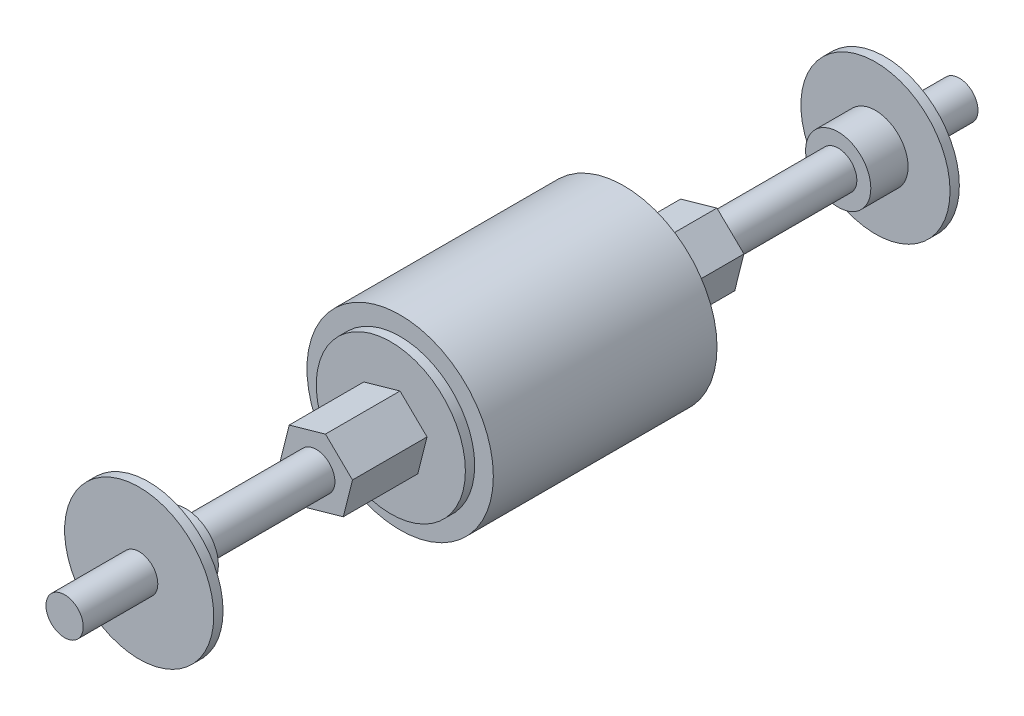
ISO-10303-21;
HEADER;
FILE_DESCRIPTION(('STEP AP214'),'2;1');
FILE_NAME('part.step','',(''),(''),'','','');
FILE_SCHEMA(('AUTOMOTIVE_DESIGN { 1 0 10303 214 1 1 1 1 }'));
ENDSEC;
DATA;
#1=APPLICATION_CONTEXT('core data for automotive mechanical design processes');
#2=APPLICATION_PROTOCOL_DEFINITION('international standard','automotive_design',2000,#1);
#3=PRODUCT_CONTEXT('',#1,'mechanical');
#4=PRODUCT('Part','Part','',(#3));
#5=PRODUCT_RELATED_PRODUCT_CATEGORY('part','',(#4));
#6=PRODUCT_DEFINITION_FORMATION('','',#4);
#7=PRODUCT_DEFINITION_CONTEXT('part definition',#1,'design');
#8=PRODUCT_DEFINITION('design','',#6,#7);
#9=PRODUCT_DEFINITION_SHAPE('','',#8);
#10=(LENGTH_UNIT() NAMED_UNIT(*) SI_UNIT(.MILLI.,.METRE.));
#11=(NAMED_UNIT(*) PLANE_ANGLE_UNIT() SI_UNIT($,.RADIAN.));
#12=(NAMED_UNIT(*) SI_UNIT($,.STERADIAN.) SOLID_ANGLE_UNIT());
#13=UNCERTAINTY_MEASURE_WITH_UNIT(LENGTH_MEASURE(1.E-05),#10,'distance_accuracy_value','');
#14=(GEOMETRIC_REPRESENTATION_CONTEXT(3) GLOBAL_UNCERTAINTY_ASSIGNED_CONTEXT((#13)) GLOBAL_UNIT_ASSIGNED_CONTEXT((#10,
#11,#12)) REPRESENTATION_CONTEXT('',''));
#15=CARTESIAN_POINT('',(0.,0.,0.));
#16=DIRECTION('',(0.,0.,1.));
#17=DIRECTION('',(1.,0.,0.));
#18=AXIS2_PLACEMENT_3D('',#15,#16,#17);
#19=CARTESIAN_POINT('',(0.,0.,-20.6375));
#20=DIRECTION('',(0.,0.,-1.));
#21=DIRECTION('',(1.,0.,0.));
#22=AXIS2_PLACEMENT_3D('',#19,#20,#21);
#23=PLANE('',#22);
#24=CARTESIAN_POINT('',(0.,0.,-20.6375));
#25=DIRECTION('',(0.,0.,1.));
#26=DIRECTION('',(1.,0.,0.));
#27=AXIS2_PLACEMENT_3D('',#24,#25,#26);
#28=CIRCLE('',#27,12.7);
#29=CARTESIAN_POINT('',(12.7,0.,-20.6375));
#30=VERTEX_POINT('',#29);
#31=EDGE_CURVE('E209',#30,#30,#28,.T.);
#32=ORIENTED_EDGE('',*,*,#31,.F.);
#33=EDGE_LOOP('',(#32));
#34=FACE_BOUND('',#33,.T.);
#35=DIRECTION('',(0.717469018062941,-0.696590416327844,0.));
#36=VECTOR('',#35,1.);
#37=CARTESIAN_POINT('',(-6.17200110950044,-1.75184314014087,-20.6375));
#38=LINE('',#37,#36);
#39=CARTESIAN_POINT('',(-6.17200110950044,-1.75184314014087,-20.6375));
#40=VERTEX_POINT('',#39);
#41=CARTESIAN_POINT('',(-1.56885989194273,-6.22103132308356,-20.6375));
#42=VERTEX_POINT('',#41);
#43=EDGE_CURVE('E177',#40,#42,#38,.T.);
#44=ORIENTED_EDGE('',*,*,#43,.T.);
#45=DIRECTION('',(0.961999505604162,0.273051187906861,0.));
#46=VECTOR('',#45,1.);
#47=CARTESIAN_POINT('',(-1.56885989194273,-6.22103132308356,-20.6375));
#48=LINE('',#47,#46);
#49=CARTESIAN_POINT('',(4.60314121755772,-4.46918818294269,-20.6375));
#50=VERTEX_POINT('',#49);
#51=EDGE_CURVE('E59',#42,#50,#48,.T.);
#52=ORIENTED_EDGE('',*,*,#51,.T.);
#53=DIRECTION('',(0.244530487541221,0.969641604234705,0.));
#54=VECTOR('',#53,1.);
#55=CARTESIAN_POINT('',(4.60314121755772,-4.46918818294269,-20.6375));
#56=LINE('',#55,#54);
#57=CARTESIAN_POINT('',(6.17200110950044,1.75184314014087,-20.6375));
#58=VERTEX_POINT('',#57);
#59=EDGE_CURVE('E154',#50,#58,#56,.T.);
#60=ORIENTED_EDGE('',*,*,#59,.T.);
#61=DIRECTION('',(-0.717469018062941,0.696590416327844,0.));
#62=VECTOR('',#61,1.);
#63=CARTESIAN_POINT('',(6.17200110950044,1.75184314014087,-20.6375));
#64=LINE('',#63,#62);
#65=CARTESIAN_POINT('',(1.56885989194273,6.22103132308356,-20.6375));
#66=VERTEX_POINT('',#65);
#67=EDGE_CURVE('E189',#58,#66,#64,.T.);
#68=ORIENTED_EDGE('',*,*,#67,.T.);
#69=DIRECTION('',(-0.961999505604162,-0.273051187906861,0.));
#70=VECTOR('',#69,1.);
#71=CARTESIAN_POINT('',(1.56885989194273,6.22103132308356,-20.6375));
#72=LINE('',#71,#70);
#73=CARTESIAN_POINT('',(-4.60314121755772,4.46918818294269,-20.6375));
#74=VERTEX_POINT('',#73);
#75=EDGE_CURVE('E185',#66,#74,#72,.T.);
#76=ORIENTED_EDGE('',*,*,#75,.T.);
#77=DIRECTION('',(-0.244530487541221,-0.969641604234705,0.));
#78=VECTOR('',#77,1.);
#79=CARTESIAN_POINT('',(-4.60314121755772,4.46918818294269,-20.6375));
#80=LINE('',#79,#78);
#81=EDGE_CURVE('E181',#74,#40,#80,.T.);
#82=ORIENTED_EDGE('',*,*,#81,.T.);
#83=EDGE_LOOP('',(#44,#52,#60,#68,#76,#82));
#84=FACE_BOUND('',#83,.T.);
#85=ADVANCED_FACE('F41',(#34,#84),#23,.T.);
#86=CARTESIAN_POINT('',(0.,0.,19.05));
#87=DIRECTION('',(0.,0.,-1.));
#88=DIRECTION('',(-1.,0.,0.));
#89=AXIS2_PLACEMENT_3D('',#86,#87,#88);
#90=CYLINDRICAL_SURFACE('',#89,15.875);
#91=CARTESIAN_POINT('',(0.,0.,19.05));
#92=DIRECTION('',(0.,0.,1.));
#93=DIRECTION('',(1.,0.,0.));
#94=AXIS2_PLACEMENT_3D('',#91,#92,#93);
#95=CIRCLE('',#94,15.875);
#96=CARTESIAN_POINT('',(15.875,0.,19.05));
#97=VERTEX_POINT('',#96);
#98=EDGE_CURVE('E45',#97,#97,#95,.T.);
#99=ORIENTED_EDGE('',*,*,#98,.F.);
#100=EDGE_LOOP('',(#99));
#101=FACE_BOUND('',#100,.T.);
#102=CARTESIAN_POINT('',(0.,0.,-19.05));
#103=DIRECTION('',(0.,0.,1.));
#104=DIRECTION('',(1.,0.,0.));
#105=AXIS2_PLACEMENT_3D('',#102,#103,#104);
#106=CIRCLE('',#105,15.875);
#107=CARTESIAN_POINT('',(15.875,0.,-19.05));
#108=VERTEX_POINT('',#107);
#109=EDGE_CURVE('E213',#108,#108,#106,.T.);
#110=ORIENTED_EDGE('',*,*,#109,.T.);
#111=EDGE_LOOP('',(#110));
#112=FACE_BOUND('',#111,.T.);
#113=ADVANCED_FACE('F43',(#101,#112),#90,.T.);
#114=CARTESIAN_POINT('',(0.,0.,19.05));
#115=DIRECTION('',(0.,0.,1.));
#116=DIRECTION('',(1.,0.,0.));
#117=AXIS2_PLACEMENT_3D('',#114,#115,#116);
#118=PLANE('',#117);
#119=CARTESIAN_POINT('',(0.,0.,19.05));
#120=DIRECTION('',(0.,0.,1.));
#121=DIRECTION('',(1.,0.,0.));
#122=AXIS2_PLACEMENT_3D('',#119,#120,#121);
#123=CIRCLE('',#122,12.7);
#124=CARTESIAN_POINT('',(12.7,0.,19.05));
#125=VERTEX_POINT('',#124);
#126=EDGE_CURVE('E247',#125,#125,#123,.T.);
#127=ORIENTED_EDGE('',*,*,#126,.F.);
#128=EDGE_LOOP('',(#127));
#129=FACE_BOUND('',#128,.T.);
#130=ORIENTED_EDGE('',*,*,#98,.T.);
#131=EDGE_LOOP('',(#130));
#132=FACE_BOUND('',#131,.T.);
#133=ADVANCED_FACE('F323',(#129,#132),#118,.T.);
#134=CARTESIAN_POINT('',(0.,0.,20.6375));
#135=DIRECTION('',(0.,0.,-1.));
#136=DIRECTION('',(-1.,0.,0.));
#137=AXIS2_PLACEMENT_3D('',#134,#135,#136);
#138=CYLINDRICAL_SURFACE('',#137,12.7);
#139=CARTESIAN_POINT('',(0.,0.,20.6375));
#140=DIRECTION('',(0.,0.,1.));
#141=DIRECTION('',(1.,0.,0.));
#142=AXIS2_PLACEMENT_3D('',#139,#140,#141);
#143=CIRCLE('',#142,12.7);
#144=CARTESIAN_POINT('',(12.7,0.,20.6375));
#145=VERTEX_POINT('',#144);
#146=EDGE_CURVE('E312',#145,#145,#143,.T.);
#147=ORIENTED_EDGE('',*,*,#146,.F.);
#148=EDGE_LOOP('',(#147));
#149=FACE_BOUND('',#148,.T.);
#150=ORIENTED_EDGE('',*,*,#126,.T.);
#151=EDGE_LOOP('',(#150));
#152=FACE_BOUND('',#151,.T.);
#153=ADVANCED_FACE('F687',(#149,#152),#138,.T.);
#154=CARTESIAN_POINT('',(0.,0.,20.6375));
#155=DIRECTION('',(0.,0.,1.));
#156=DIRECTION('',(1.,0.,0.));
#157=AXIS2_PLACEMENT_3D('',#154,#155,#156);
#158=PLANE('',#157);
#159=DIRECTION('',(0.961999505604162,0.273051187906861,0.));
#160=VECTOR('',#159,1.);
#161=CARTESIAN_POINT('',(-1.56885989194273,-6.22103132308356,20.6375));
#162=LINE('',#161,#160);
#163=CARTESIAN_POINT('',(-1.56885989194273,-6.22103132308356,20.6375));
#164=VERTEX_POINT('',#163);
#165=CARTESIAN_POINT('',(4.60314121755772,-4.46918818294269,20.6375));
#166=VERTEX_POINT('',#165);
#167=EDGE_CURVE('E67',#164,#166,#162,.T.);
#168=ORIENTED_EDGE('',*,*,#167,.F.);
#169=DIRECTION('',(0.717469018062941,-0.696590416327844,0.));
#170=VECTOR('',#169,1.);
#171=CARTESIAN_POINT('',(-6.17200110950044,-1.75184314014087,20.6375));
#172=LINE('',#171,#170);
#173=CARTESIAN_POINT('',(-6.17200110950044,-1.75184314014087,20.6375));
#174=VERTEX_POINT('',#173);
#175=EDGE_CURVE('E253',#174,#164,#172,.T.);
#176=ORIENTED_EDGE('',*,*,#175,.F.);
#177=DIRECTION('',(-0.244530487541221,-0.969641604234705,0.));
#178=VECTOR('',#177,1.);
#179=CARTESIAN_POINT('',(-4.60314121755772,4.46918818294269,20.6375));
#180=LINE('',#179,#178);
#181=CARTESIAN_POINT('',(-4.60314121755772,4.46918818294269,20.6375));
#182=VERTEX_POINT('',#181);
#183=EDGE_CURVE('E283',#182,#174,#180,.T.);
#184=ORIENTED_EDGE('',*,*,#183,.F.);
#185=DIRECTION('',(-0.961999505604162,-0.273051187906861,0.));
#186=VECTOR('',#185,1.);
#187=CARTESIAN_POINT('',(1.56885989194273,6.22103132308356,20.6375));
#188=LINE('',#187,#186);
#189=CARTESIAN_POINT('',(1.56885989194273,6.22103132308356,20.6375));
#190=VERTEX_POINT('',#189);
#191=EDGE_CURVE('E279',#190,#182,#188,.T.);
#192=ORIENTED_EDGE('',*,*,#191,.F.);
#193=DIRECTION('',(-0.717469018062941,0.696590416327844,0.));
#194=VECTOR('',#193,1.);
#195=CARTESIAN_POINT('',(6.17200110950044,1.75184314014087,20.6375));
#196=LINE('',#195,#194);
#197=CARTESIAN_POINT('',(6.17200110950044,1.75184314014087,20.6375));
#198=VERTEX_POINT('',#197);
#199=EDGE_CURVE('E275',#198,#190,#196,.T.);
#200=ORIENTED_EDGE('',*,*,#199,.F.);
#201=DIRECTION('',(0.244530487541221,0.969641604234705,0.));
#202=VECTOR('',#201,1.);
#203=CARTESIAN_POINT('',(4.60314121755772,-4.46918818294269,20.6375));
#204=LINE('',#203,#202);
#205=EDGE_CURVE('E271',#166,#198,#204,.T.);
#206=ORIENTED_EDGE('',*,*,#205,.F.);
#207=EDGE_LOOP('',(#168,#176,#184,#192,#200,#206));
#208=FACE_BOUND('',#207,.T.);
#209=ORIENTED_EDGE('',*,*,#146,.T.);
#210=EDGE_LOOP('',(#209));
#211=FACE_BOUND('',#210,.T.);
#212=ADVANCED_FACE('F677',(#208,#211),#158,.T.);
#213=CARTESIAN_POINT('',(-1.56885989194273,-6.22103132308356,33.3375));
#214=DIRECTION('',(-0.273051187906861,0.961999505604162,0.));
#215=DIRECTION('',(-0.961999505604162,-0.273051187906861,0.));
#216=AXIS2_PLACEMENT_3D('',#213,#214,#215);
#217=PLANE('',#216);
#218=ORIENTED_EDGE('',*,*,#167,.T.);
#219=DIRECTION('',(0.,0.,-1.));
#220=VECTOR('',#219,1.);
#221=CARTESIAN_POINT('',(4.60314121755772,-4.46918818294269,33.3375));
#222=LINE('',#221,#220);
#223=CARTESIAN_POINT('',(4.60314121755772,-4.46918818294269,33.3375));
#224=VERTEX_POINT('',#223);
#225=EDGE_CURVE('E308',#224,#166,#222,.T.);
#226=ORIENTED_EDGE('',*,*,#225,.F.);
#227=DIRECTION('',(0.961999505604162,0.273051187906861,0.));
#228=VECTOR('',#227,1.);
#229=CARTESIAN_POINT('',(-1.56885989194273,-6.22103132308356,33.3375));
#230=LINE('',#229,#228);
#231=CARTESIAN_POINT('',(-1.56885989194273,-6.22103132308356,33.3375));
#232=VERTEX_POINT('',#231);
#233=EDGE_CURVE('E248',#232,#224,#230,.T.);
#234=ORIENTED_EDGE('',*,*,#233,.F.);
#235=DIRECTION('',(0.,0.,-1.));
#236=VECTOR('',#235,1.);
#237=CARTESIAN_POINT('',(-1.56885989194273,-6.22103132308356,33.3375));
#238=LINE('',#237,#236);
#239=EDGE_CURVE('E268',#232,#164,#238,.T.);
#240=ORIENTED_EDGE('',*,*,#239,.T.);
#241=EDGE_LOOP('',(#218,#226,#234,#240));
#242=FACE_BOUND('',#241,.T.);
#243=ADVANCED_FACE('F667',(#242),#217,.F.);
#244=CARTESIAN_POINT('',(4.60314121755772,-4.46918818294269,33.3375));
#245=DIRECTION('',(-0.969641604234705,0.244530487541221,0.));
#246=DIRECTION('',(-0.244530487541221,-0.969641604234705,0.));
#247=AXIS2_PLACEMENT_3D('',#244,#245,#246);
#248=PLANE('',#247);
#249=ORIENTED_EDGE('',*,*,#205,.T.);
#250=DIRECTION('',(0.,0.,-1.));
#251=VECTOR('',#250,1.);
#252=CARTESIAN_POINT('',(6.17200110950044,1.75184314014087,33.3375));
#253=LINE('',#252,#251);
#254=CARTESIAN_POINT('',(6.17200110950044,1.75184314014087,33.3375));
#255=VERTEX_POINT('',#254);
#256=EDGE_CURVE('E304',#255,#198,#253,.T.);
#257=ORIENTED_EDGE('',*,*,#256,.F.);
#258=DIRECTION('',(0.244530487541221,0.969641604234705,0.));
#259=VECTOR('',#258,1.);
#260=CARTESIAN_POINT('',(4.60314121755772,-4.46918818294269,33.3375));
#261=LINE('',#260,#259);
#262=EDGE_CURVE('E252',#224,#255,#261,.T.);
#263=ORIENTED_EDGE('',*,*,#262,.F.);
#264=ORIENTED_EDGE('',*,*,#225,.T.);
#265=EDGE_LOOP('',(#249,#257,#263,#264));
#266=FACE_BOUND('',#265,.T.);
#267=ADVANCED_FACE('F657',(#266),#248,.F.);
#268=CARTESIAN_POINT('',(6.17200110950044,1.75184314014087,33.3375));
#269=DIRECTION('',(-0.696590416327844,-0.717469018062941,0.));
#270=DIRECTION('',(0.717469018062941,-0.696590416327844,0.));
#271=AXIS2_PLACEMENT_3D('',#268,#269,#270);
#272=PLANE('',#271);
#273=ORIENTED_EDGE('',*,*,#199,.T.);
#274=DIRECTION('',(0.,0.,-1.));
#275=VECTOR('',#274,1.);
#276=CARTESIAN_POINT('',(1.56885989194273,6.22103132308356,33.3375));
#277=LINE('',#276,#275);
#278=CARTESIAN_POINT('',(1.56885989194273,6.22103132308356,33.3375));
#279=VERTEX_POINT('',#278);
#280=EDGE_CURVE('E300',#279,#190,#277,.T.);
#281=ORIENTED_EDGE('',*,*,#280,.F.);
#282=DIRECTION('',(-0.717469018062941,0.696590416327844,0.));
#283=VECTOR('',#282,1.);
#284=CARTESIAN_POINT('',(6.17200110950044,1.75184314014087,33.3375));
#285=LINE('',#284,#283);
#286=EDGE_CURVE('E256',#255,#279,#285,.T.);
#287=ORIENTED_EDGE('',*,*,#286,.F.);
#288=ORIENTED_EDGE('',*,*,#256,.T.);
#289=EDGE_LOOP('',(#273,#281,#287,#288));
#290=FACE_BOUND('',#289,.T.);
#291=ADVANCED_FACE('F647',(#290),#272,.F.);
#292=CARTESIAN_POINT('',(1.56885989194273,6.22103132308356,33.3375));
#293=DIRECTION('',(0.273051187906861,-0.961999505604162,0.));
#294=DIRECTION('',(0.961999505604162,0.273051187906861,0.));
#295=AXIS2_PLACEMENT_3D('',#292,#293,#294);
#296=PLANE('',#295);
#297=ORIENTED_EDGE('',*,*,#191,.T.);
#298=DIRECTION('',(0.,0.,-1.));
#299=VECTOR('',#298,1.);
#300=CARTESIAN_POINT('',(-4.60314121755772,4.46918818294269,33.3375));
#301=LINE('',#300,#299);
#302=CARTESIAN_POINT('',(-4.60314121755772,4.46918818294269,33.3375));
#303=VERTEX_POINT('',#302);
#304=EDGE_CURVE('E296',#303,#182,#301,.T.);
#305=ORIENTED_EDGE('',*,*,#304,.F.);
#306=DIRECTION('',(-0.961999505604162,-0.273051187906861,0.));
#307=VECTOR('',#306,1.);
#308=CARTESIAN_POINT('',(1.56885989194273,6.22103132308356,33.3375));
#309=LINE('',#308,#307);
#310=EDGE_CURVE('E259',#279,#303,#309,.T.);
#311=ORIENTED_EDGE('',*,*,#310,.F.);
#312=ORIENTED_EDGE('',*,*,#280,.T.);
#313=EDGE_LOOP('',(#297,#305,#311,#312));
#314=FACE_BOUND('',#313,.T.);
#315=ADVANCED_FACE('F637',(#314),#296,.F.);
#316=CARTESIAN_POINT('',(-4.60314121755772,4.46918818294269,33.3375));
#317=DIRECTION('',(0.969641604234705,-0.244530487541221,0.));
#318=DIRECTION('',(0.244530487541221,0.969641604234705,0.));
#319=AXIS2_PLACEMENT_3D('',#316,#317,#318);
#320=PLANE('',#319);
#321=ORIENTED_EDGE('',*,*,#183,.T.);
#322=DIRECTION('',(0.,0.,-1.));
#323=VECTOR('',#322,1.);
#324=CARTESIAN_POINT('',(-6.17200110950044,-1.75184314014087,33.3375));
#325=LINE('',#324,#323);
#326=CARTESIAN_POINT('',(-6.17200110950044,-1.75184314014087,33.3375));
#327=VERTEX_POINT('',#326);
#328=EDGE_CURVE('E292',#327,#174,#325,.T.);
#329=ORIENTED_EDGE('',*,*,#328,.F.);
#330=DIRECTION('',(-0.244530487541221,-0.969641604234705,0.));
#331=VECTOR('',#330,1.);
#332=CARTESIAN_POINT('',(-4.60314121755772,4.46918818294269,33.3375));
#333=LINE('',#332,#331);
#334=EDGE_CURVE('E262',#303,#327,#333,.T.);
#335=ORIENTED_EDGE('',*,*,#334,.F.);
#336=ORIENTED_EDGE('',*,*,#304,.T.);
#337=EDGE_LOOP('',(#321,#329,#335,#336));
#338=FACE_BOUND('',#337,.T.);
#339=ADVANCED_FACE('F627',(#338),#320,.F.);
#340=CARTESIAN_POINT('',(-6.17200110950044,-1.75184314014087,33.3375));
#341=DIRECTION('',(0.696590416327844,0.717469018062941,0.));
#342=DIRECTION('',(-0.717469018062941,0.696590416327844,0.));
#343=AXIS2_PLACEMENT_3D('',#340,#341,#342);
#344=PLANE('',#343);
#345=ORIENTED_EDGE('',*,*,#175,.T.);
#346=ORIENTED_EDGE('',*,*,#239,.F.);
#347=DIRECTION('',(0.717469018062941,-0.696590416327844,0.));
#348=VECTOR('',#347,1.);
#349=CARTESIAN_POINT('',(-6.17200110950044,-1.75184314014087,33.3375));
#350=LINE('',#349,#348);
#351=EDGE_CURVE('E265',#327,#232,#350,.T.);
#352=ORIENTED_EDGE('',*,*,#351,.F.);
#353=ORIENTED_EDGE('',*,*,#328,.T.);
#354=EDGE_LOOP('',(#345,#346,#352,#353));
#355=FACE_BOUND('',#354,.T.);
#356=ADVANCED_FACE('F617',(#355),#344,.F.);
#357=CARTESIAN_POINT('',(0.,0.,33.3375));
#358=DIRECTION('',(0.,0.,1.));
#359=DIRECTION('',(1.,0.,0.));
#360=AXIS2_PLACEMENT_3D('',#357,#358,#359);
#361=PLANE('',#360);
#362=CARTESIAN_POINT('',(0.,0.,33.3375));
#363=DIRECTION('',(0.,0.,1.));
#364=DIRECTION('',(1.,0.,0.));
#365=AXIS2_PLACEMENT_3D('',#362,#363,#364);
#366=CIRCLE('',#365,3.175);
#367=CARTESIAN_POINT('',(3.175,0.,33.3375));
#368=VERTEX_POINT('',#367);
#369=EDGE_CURVE('E51',#368,#368,#366,.T.);
#370=ORIENTED_EDGE('',*,*,#369,.F.);
#371=EDGE_LOOP('',(#370));
#372=FACE_BOUND('',#371,.T.);
#373=ORIENTED_EDGE('',*,*,#233,.T.);
#374=ORIENTED_EDGE('',*,*,#262,.T.);
#375=ORIENTED_EDGE('',*,*,#286,.T.);
#376=ORIENTED_EDGE('',*,*,#310,.T.);
#377=ORIENTED_EDGE('',*,*,#334,.T.);
#378=ORIENTED_EDGE('',*,*,#351,.T.);
#379=EDGE_LOOP('',(#373,#374,#375,#376,#377,#378));
#380=FACE_BOUND('',#379,.T.);
#381=ADVANCED_FACE('F607',(#372,#380),#361,.T.);
#382=CARTESIAN_POINT('',(0.,0.,55.5625));
#383=DIRECTION('',(0.,0.,-1.));
#384=DIRECTION('',(-1.,0.,0.));
#385=AXIS2_PLACEMENT_3D('',#382,#383,#384);
#386=CYLINDRICAL_SURFACE('',#385,3.175);
#387=CARTESIAN_POINT('',(0.,0.,55.5625));
#388=DIRECTION('',(0.,0.,1.));
#389=DIRECTION('',(1.,0.,0.));
#390=AXIS2_PLACEMENT_3D('',#387,#388,#389);
#391=CIRCLE('',#390,3.175);
#392=CARTESIAN_POINT('',(3.175,0.,55.5625));
#393=VERTEX_POINT('',#392);
#394=EDGE_CURVE('E237',#393,#393,#391,.T.);
#395=ORIENTED_EDGE('',*,*,#394,.F.);
#396=EDGE_LOOP('',(#395));
#397=FACE_BOUND('',#396,.T.);
#398=ORIENTED_EDGE('',*,*,#369,.T.);
#399=EDGE_LOOP('',(#398));
#400=FACE_BOUND('',#399,.T.);
#401=ADVANCED_FACE('F597',(#397,#400),#386,.T.);
#402=CARTESIAN_POINT('',(0.,0.,61.9125));
#403=DIRECTION('',(0.,0.,-1.));
#404=DIRECTION('',(-1.,0.,0.));
#405=AXIS2_PLACEMENT_3D('',#402,#403,#404);
#406=CYLINDRICAL_SURFACE('',#405,5.55625);
#407=CARTESIAN_POINT('',(0.,0.,61.9125));
#408=DIRECTION('',(0.,0.,1.));
#409=DIRECTION('',(1.,0.,0.));
#410=AXIS2_PLACEMENT_3D('',#407,#408,#409);
#411=CIRCLE('',#410,5.55625);
#412=CARTESIAN_POINT('',(5.55625,0.,61.9125));
#413=VERTEX_POINT('',#412);
#414=EDGE_CURVE('E233',#413,#413,#411,.T.);
#415=ORIENTED_EDGE('',*,*,#414,.F.);
#416=EDGE_LOOP('',(#415));
#417=FACE_BOUND('',#416,.T.);
#418=CARTESIAN_POINT('',(0.,0.,55.5625));
#419=DIRECTION('',(0.,0.,1.));
#420=DIRECTION('',(1.,0.,0.));
#421=AXIS2_PLACEMENT_3D('',#418,#419,#420);
#422=CIRCLE('',#421,5.55625);
#423=CARTESIAN_POINT('',(5.55625,0.,55.5625));
#424=VERTEX_POINT('',#423);
#425=EDGE_CURVE('E229',#424,#424,#422,.T.);
#426=ORIENTED_EDGE('',*,*,#425,.T.);
#427=EDGE_LOOP('',(#426));
#428=FACE_BOUND('',#427,.T.);
#429=ADVANCED_FACE('F587',(#417,#428),#406,.T.);
#430=CARTESIAN_POINT('',(0.,0.,55.5625));
#431=DIRECTION('',(0.,0.,1.));
#432=DIRECTION('',(1.,0.,0.));
#433=AXIS2_PLACEMENT_3D('',#430,#431,#432);
#434=PLANE('',#433);
#435=ORIENTED_EDGE('',*,*,#394,.T.);
#436=EDGE_LOOP('',(#435));
#437=FACE_BOUND('',#436,.T.);
#438=ORIENTED_EDGE('',*,*,#425,.F.);
#439=EDGE_LOOP('',(#438));
#440=FACE_BOUND('',#439,.T.);
#441=ADVANCED_FACE('F577',(#437,#440),#434,.F.);
#442=CARTESIAN_POINT('',(0.,0.,63.5));
#443=DIRECTION('',(0.,0.,-1.));
#444=DIRECTION('',(-1.,0.,0.));
#445=AXIS2_PLACEMENT_3D('',#442,#443,#444);
#446=CYLINDRICAL_SURFACE('',#445,12.7);
#447=CARTESIAN_POINT('',(0.,0.,63.5));
#448=DIRECTION('',(0.,0.,1.));
#449=DIRECTION('',(1.,0.,0.));
#450=AXIS2_PLACEMENT_3D('',#447,#448,#449);
#451=CIRCLE('',#450,12.7);
#452=CARTESIAN_POINT('',(12.7,0.,63.5));
#453=VERTEX_POINT('',#452);
#454=EDGE_CURVE('E225',#453,#453,#451,.T.);
#455=ORIENTED_EDGE('',*,*,#454,.F.);
#456=EDGE_LOOP('',(#455));
#457=FACE_BOUND('',#456,.T.);
#458=CARTESIAN_POINT('',(0.,0.,61.9125));
#459=DIRECTION('',(0.,0.,1.));
#460=DIRECTION('',(1.,0.,0.));
#461=AXIS2_PLACEMENT_3D('',#458,#459,#460);
#462=CIRCLE('',#461,12.7);
#463=CARTESIAN_POINT('',(12.7,0.,61.9125));
#464=VERTEX_POINT('',#463);
#465=EDGE_CURVE('E223',#464,#464,#462,.T.);
#466=ORIENTED_EDGE('',*,*,#465,.T.);
#467=EDGE_LOOP('',(#466));
#468=FACE_BOUND('',#467,.T.);
#469=ADVANCED_FACE('F560',(#457,#468),#446,.T.);
#470=CARTESIAN_POINT('',(0.,0.,63.5));
#471=DIRECTION('',(0.,0.,1.));
#472=DIRECTION('',(1.,0.,0.));
#473=AXIS2_PLACEMENT_3D('',#470,#471,#472);
#474=PLANE('',#473);
#475=CARTESIAN_POINT('',(0.,0.,63.5));
#476=DIRECTION('',(0.,0.,1.));
#477=DIRECTION('',(1.,0.,0.));
#478=AXIS2_PLACEMENT_3D('',#475,#476,#477);
#479=CIRCLE('',#478,3.175);
#480=CARTESIAN_POINT('',(3.175,0.,63.5));
#481=VERTEX_POINT('',#480);
#482=EDGE_CURVE('E11',#481,#481,#479,.T.);
#483=ORIENTED_EDGE('',*,*,#482,.F.);
#484=EDGE_LOOP('',(#483));
#485=FACE_BOUND('',#484,.T.);
#486=ORIENTED_EDGE('',*,*,#454,.T.);
#487=EDGE_LOOP('',(#486));
#488=FACE_BOUND('',#487,.T.);
#489=ADVANCED_FACE('F555',(#485,#488),#474,.T.);
#490=CARTESIAN_POINT('',(0.,0.,61.9125));
#491=DIRECTION('',(0.,0.,1.));
#492=DIRECTION('',(1.,0.,0.));
#493=AXIS2_PLACEMENT_3D('',#490,#491,#492);
#494=PLANE('',#493);
#495=ORIENTED_EDGE('',*,*,#414,.T.);
#496=EDGE_LOOP('',(#495));
#497=FACE_BOUND('',#496,.T.);
#498=ORIENTED_EDGE('',*,*,#465,.F.);
#499=EDGE_LOOP('',(#498));
#500=FACE_BOUND('',#499,.T.);
#501=ADVANCED_FACE('F547',(#497,#500),#494,.F.);
#502=CARTESIAN_POINT('',(0.,0.,76.2));
#503=DIRECTION('',(0.,0.,-1.));
#504=DIRECTION('',(-1.,0.,0.));
#505=AXIS2_PLACEMENT_3D('',#502,#503,#504);
#506=CYLINDRICAL_SURFACE('',#505,3.175);
#507=CARTESIAN_POINT('',(0.,0.,76.2));
#508=DIRECTION('',(0.,0.,1.));
#509=DIRECTION('',(1.,0.,0.));
#510=AXIS2_PLACEMENT_3D('',#507,#508,#509);
#511=CIRCLE('',#510,3.175);
#512=CARTESIAN_POINT('',(3.175,0.,76.2));
#513=VERTEX_POINT('',#512);
#514=EDGE_CURVE('E220',#513,#513,#511,.T.);
#515=ORIENTED_EDGE('',*,*,#514,.F.);
#516=EDGE_LOOP('',(#515));
#517=FACE_BOUND('',#516,.T.);
#518=ORIENTED_EDGE('',*,*,#482,.T.);
#519=EDGE_LOOP('',(#518));
#520=FACE_BOUND('',#519,.T.);
#521=ADVANCED_FACE('F341',(#517,#520),#506,.T.);
#522=CARTESIAN_POINT('',(0.,0.,76.2));
#523=DIRECTION('',(0.,0.,1.));
#524=DIRECTION('',(1.,0.,0.));
#525=AXIS2_PLACEMENT_3D('',#522,#523,#524);
#526=PLANE('',#525);
#527=ORIENTED_EDGE('',*,*,#514,.T.);
#528=EDGE_LOOP('',(#527));
#529=FACE_BOUND('',#528,.T.);
#530=ADVANCED_FACE('F332',(#529),#526,.T.);
#531=CARTESIAN_POINT('',(0.,0.,-19.05));
#532=DIRECTION('',(0.,0.,-1.));
#533=DIRECTION('',(1.,0.,0.));
#534=AXIS2_PLACEMENT_3D('',#531,#532,#533);
#535=PLANE('',#534);
#536=CARTESIAN_POINT('',(0.,0.,-19.05));
#537=DIRECTION('',(0.,0.,1.));
#538=DIRECTION('',(1.,0.,0.));
#539=AXIS2_PLACEMENT_3D('',#536,#537,#538);
#540=CIRCLE('',#539,12.7);
#541=CARTESIAN_POINT('',(12.7,0.,-19.05));
#542=VERTEX_POINT('',#541);
#543=EDGE_CURVE('E141',#542,#542,#540,.T.);
#544=ORIENTED_EDGE('',*,*,#543,.T.);
#545=EDGE_LOOP('',(#544));
#546=FACE_BOUND('',#545,.T.);
#547=ORIENTED_EDGE('',*,*,#109,.F.);
#548=EDGE_LOOP('',(#547));
#549=FACE_BOUND('',#548,.T.);
#550=ADVANCED_FACE('F329',(#546,#549),#535,.T.);
#551=CARTESIAN_POINT('',(0.,0.,-20.6375));
#552=DIRECTION('',(0.,0.,1.));
#553=DIRECTION('',(1.,0.,0.));
#554=AXIS2_PLACEMENT_3D('',#551,#552,#553);
#555=CYLINDRICAL_SURFACE('',#554,12.7);
#556=ORIENTED_EDGE('',*,*,#31,.T.);
#557=EDGE_LOOP('',(#556));
#558=FACE_BOUND('',#557,.T.);
#559=ORIENTED_EDGE('',*,*,#543,.F.);
#560=EDGE_LOOP('',(#559));
#561=FACE_BOUND('',#560,.T.);
#562=ADVANCED_FACE('F331',(#558,#561),#555,.T.);
#563=CARTESIAN_POINT('',(-1.56885989194273,-6.22103132308356,-33.3375));
#564=DIRECTION('',(0.273051187906861,-0.961999505604162,0.));
#565=DIRECTION('',(0.961999505604162,0.273051187906861,0.));
#566=AXIS2_PLACEMENT_3D('',#563,#564,#565);
#567=PLANE('',#566);
#568=ORIENTED_EDGE('',*,*,#51,.F.);
#569=DIRECTION('',(0.,0.,1.));
#570=VECTOR('',#569,1.);
#571=CARTESIAN_POINT('',(-1.56885989194273,-6.22103132308356,-33.3375));
#572=LINE('',#571,#570);
#573=CARTESIAN_POINT('',(-1.56885989194273,-6.22103132308356,-33.3375));
#574=VERTEX_POINT('',#573);
#575=EDGE_CURVE('E131',#574,#42,#572,.T.);
#576=ORIENTED_EDGE('',*,*,#575,.F.);
#577=DIRECTION('',(0.961999505604162,0.273051187906861,0.));
#578=VECTOR('',#577,1.);
#579=CARTESIAN_POINT('',(-1.56885989194273,-6.22103132308356,-33.3375));
#580=LINE('',#579,#578);
#581=CARTESIAN_POINT('',(4.60314121755772,-4.46918818294269,-33.3375));
#582=VERTEX_POINT('',#581);
#583=EDGE_CURVE('E134',#574,#582,#580,.T.);
#584=ORIENTED_EDGE('',*,*,#583,.T.);
#585=DIRECTION('',(0.,0.,1.));
#586=VECTOR('',#585,1.);
#587=CARTESIAN_POINT('',(4.60314121755772,-4.46918818294269,-33.3375));
#588=LINE('',#587,#586);
#589=EDGE_CURVE('E174',#582,#50,#588,.T.);
#590=ORIENTED_EDGE('',*,*,#589,.T.);
#591=EDGE_LOOP('',(#568,#576,#584,#590));
#592=FACE_BOUND('',#591,.T.);
#593=ADVANCED_FACE('F133',(#592),#567,.T.);
#594=CARTESIAN_POINT('',(-6.17200110950044,-1.75184314014087,-33.3375));
#595=DIRECTION('',(-0.696590416327844,-0.717469018062941,0.));
#596=DIRECTION('',(0.717469018062941,-0.696590416327844,0.));
#597=AXIS2_PLACEMENT_3D('',#594,#595,#596);
#598=PLANE('',#597);
#599=ORIENTED_EDGE('',*,*,#43,.F.);
#600=DIRECTION('',(0.,0.,1.));
#601=VECTOR('',#600,1.);
#602=CARTESIAN_POINT('',(-6.17200110950044,-1.75184314014087,-33.3375));
#603=LINE('',#602,#601);
#604=CARTESIAN_POINT('',(-6.17200110950044,-1.75184314014087,-33.3375));
#605=VERTEX_POINT('',#604);
#606=EDGE_CURVE('E142',#605,#40,#603,.T.);
#607=ORIENTED_EDGE('',*,*,#606,.F.);
#608=DIRECTION('',(0.717469018062941,-0.696590416327844,0.));
#609=VECTOR('',#608,1.);
#610=CARTESIAN_POINT('',(-6.17200110950044,-1.75184314014087,-33.3375));
#611=LINE('',#610,#609);
#612=EDGE_CURVE('E148',#605,#574,#611,.T.);
#613=ORIENTED_EDGE('',*,*,#612,.T.);
#614=ORIENTED_EDGE('',*,*,#575,.T.);
#615=EDGE_LOOP('',(#599,#607,#613,#614));
#616=FACE_BOUND('',#615,.T.);
#617=ADVANCED_FACE('F156',(#616),#598,.T.);
#618=CARTESIAN_POINT('',(-4.60314121755772,4.46918818294269,-33.3375));
#619=DIRECTION('',(-0.969641604234705,0.244530487541221,0.));
#620=DIRECTION('',(-0.244530487541221,-0.969641604234705,0.));
#621=AXIS2_PLACEMENT_3D('',#618,#619,#620);
#622=PLANE('',#621);
#623=ORIENTED_EDGE('',*,*,#81,.F.);
#624=DIRECTION('',(0.,0.,1.));
#625=VECTOR('',#624,1.);
#626=CARTESIAN_POINT('',(-4.60314121755772,4.46918818294269,-33.3375));
#627=LINE('',#626,#625);
#628=CARTESIAN_POINT('',(-4.60314121755772,4.46918818294269,-33.3375));
#629=VERTEX_POINT('',#628);
#630=EDGE_CURVE('E204',#629,#74,#627,.T.);
#631=ORIENTED_EDGE('',*,*,#630,.F.);
#632=DIRECTION('',(-0.244530487541221,-0.969641604234705,0.));
#633=VECTOR('',#632,1.);
#634=CARTESIAN_POINT('',(-4.60314121755772,4.46918818294269,-33.3375));
#635=LINE('',#634,#633);
#636=EDGE_CURVE('E158',#629,#605,#635,.T.);
#637=ORIENTED_EDGE('',*,*,#636,.T.);
#638=ORIENTED_EDGE('',*,*,#606,.T.);
#639=EDGE_LOOP('',(#623,#631,#637,#638));
#640=FACE_BOUND('',#639,.T.);
#641=ADVANCED_FACE('F356',(#640),#622,.T.);
#642=CARTESIAN_POINT('',(1.56885989194273,6.22103132308356,-33.3375));
#643=DIRECTION('',(-0.273051187906861,0.961999505604162,0.));
#644=DIRECTION('',(-0.961999505604162,-0.273051187906861,0.));
#645=AXIS2_PLACEMENT_3D('',#642,#643,#644);
#646=PLANE('',#645);
#647=ORIENTED_EDGE('',*,*,#75,.F.);
#648=DIRECTION('',(0.,0.,1.));
#649=VECTOR('',#648,1.);
#650=CARTESIAN_POINT('',(1.56885989194273,6.22103132308356,-33.3375));
#651=LINE('',#650,#649);
#652=CARTESIAN_POINT('',(1.56885989194273,6.22103132308356,-33.3375));
#653=VERTEX_POINT('',#652);
#654=EDGE_CURVE('E201',#653,#66,#651,.T.);
#655=ORIENTED_EDGE('',*,*,#654,.F.);
#656=DIRECTION('',(-0.961999505604162,-0.273051187906861,0.));
#657=VECTOR('',#656,1.);
#658=CARTESIAN_POINT('',(1.56885989194273,6.22103132308356,-33.3375));
#659=LINE('',#658,#657);
#660=EDGE_CURVE('E161',#653,#629,#659,.T.);
#661=ORIENTED_EDGE('',*,*,#660,.T.);
#662=ORIENTED_EDGE('',*,*,#630,.T.);
#663=EDGE_LOOP('',(#647,#655,#661,#662));
#664=FACE_BOUND('',#663,.T.);
#665=ADVANCED_FACE('F359',(#664),#646,.T.);
#666=CARTESIAN_POINT('',(6.17200110950044,1.75184314014087,-33.3375));
#667=DIRECTION('',(0.696590416327844,0.717469018062941,0.));
#668=DIRECTION('',(-0.717469018062941,0.696590416327844,0.));
#669=AXIS2_PLACEMENT_3D('',#666,#667,#668);
#670=PLANE('',#669);
#671=ORIENTED_EDGE('',*,*,#67,.F.);
#672=DIRECTION('',(0.,0.,1.));
#673=VECTOR('',#672,1.);
#674=CARTESIAN_POINT('',(6.17200110950044,1.75184314014087,-33.3375));
#675=LINE('',#674,#673);
#676=CARTESIAN_POINT('',(6.17200110950044,1.75184314014087,-33.3375));
#677=VERTEX_POINT('',#676);
#678=EDGE_CURVE('E198',#677,#58,#675,.T.);
#679=ORIENTED_EDGE('',*,*,#678,.F.);
#680=DIRECTION('',(-0.717469018062941,0.696590416327844,0.));
#681=VECTOR('',#680,1.);
#682=CARTESIAN_POINT('',(6.17200110950044,1.75184314014087,-33.3375));
#683=LINE('',#682,#681);
#684=EDGE_CURVE('E168',#677,#653,#683,.T.);
#685=ORIENTED_EDGE('',*,*,#684,.T.);
#686=ORIENTED_EDGE('',*,*,#654,.T.);
#687=EDGE_LOOP('',(#671,#679,#685,#686));
#688=FACE_BOUND('',#687,.T.);
#689=ADVANCED_FACE('F363',(#688),#670,.T.);
#690=CARTESIAN_POINT('',(4.60314121755772,-4.46918818294269,-33.3375));
#691=DIRECTION('',(0.969641604234705,-0.244530487541221,0.));
#692=DIRECTION('',(0.244530487541221,0.969641604234705,0.));
#693=AXIS2_PLACEMENT_3D('',#690,#691,#692);
#694=PLANE('',#693);
#695=ORIENTED_EDGE('',*,*,#59,.F.);
#696=ORIENTED_EDGE('',*,*,#589,.F.);
#697=DIRECTION('',(0.244530487541221,0.969641604234705,0.));
#698=VECTOR('',#697,1.);
#699=CARTESIAN_POINT('',(4.60314121755772,-4.46918818294269,-33.3375));
#700=LINE('',#699,#698);
#701=EDGE_CURVE('E152',#582,#677,#700,.T.);
#702=ORIENTED_EDGE('',*,*,#701,.T.);
#703=ORIENTED_EDGE('',*,*,#678,.T.);
#704=EDGE_LOOP('',(#695,#696,#702,#703));
#705=FACE_BOUND('',#704,.T.);
#706=ADVANCED_FACE('F367',(#705),#694,.T.);
#707=CARTESIAN_POINT('',(0.,0.,-33.3375));
#708=DIRECTION('',(0.,0.,-1.));
#709=DIRECTION('',(1.,0.,0.));
#710=AXIS2_PLACEMENT_3D('',#707,#708,#709);
#711=PLANE('',#710);
#712=CARTESIAN_POINT('',(0.,0.,-33.3375));
#713=DIRECTION('',(0.,0.,1.));
#714=DIRECTION('',(1.,0.,0.));
#715=AXIS2_PLACEMENT_3D('',#712,#713,#714);
#716=CIRCLE('',#715,3.175);
#717=CARTESIAN_POINT('',(3.175,0.,-33.3375));
#718=VERTEX_POINT('',#717);
#719=EDGE_CURVE('E178',#718,#718,#716,.T.);
#720=ORIENTED_EDGE('',*,*,#719,.T.);
#721=EDGE_LOOP('',(#720));
#722=FACE_BOUND('',#721,.T.);
#723=ORIENTED_EDGE('',*,*,#583,.F.);
#724=ORIENTED_EDGE('',*,*,#612,.F.);
#725=ORIENTED_EDGE('',*,*,#636,.F.);
#726=ORIENTED_EDGE('',*,*,#660,.F.);
#727=ORIENTED_EDGE('',*,*,#684,.F.);
#728=ORIENTED_EDGE('',*,*,#701,.F.);
#729=EDGE_LOOP('',(#723,#724,#725,#726,#727,#728));
#730=FACE_BOUND('',#729,.T.);
#731=ADVANCED_FACE('F146',(#722,#730),#711,.T.);
#732=CARTESIAN_POINT('',(0.,0.,-55.5625));
#733=DIRECTION('',(0.,0.,1.));
#734=DIRECTION('',(1.,0.,0.));
#735=AXIS2_PLACEMENT_3D('',#732,#733,#734);
#736=CYLINDRICAL_SURFACE('',#735,3.175);
#737=CARTESIAN_POINT('',(0.,0.,-55.5625));
#738=DIRECTION('',(0.,0.,1.));
#739=DIRECTION('',(1.,0.,0.));
#740=AXIS2_PLACEMENT_3D('',#737,#738,#739);
#741=CIRCLE('',#740,3.175);
#742=CARTESIAN_POINT('',(3.175,0.,-55.5625));
#743=VERTEX_POINT('',#742);
#744=EDGE_CURVE('E434',#743,#743,#741,.T.);
#745=ORIENTED_EDGE('',*,*,#744,.T.);
#746=EDGE_LOOP('',(#745));
#747=FACE_BOUND('',#746,.T.);
#748=ORIENTED_EDGE('',*,*,#719,.F.);
#749=EDGE_LOOP('',(#748));
#750=FACE_BOUND('',#749,.T.);
#751=ADVANCED_FACE('F374',(#747,#750),#736,.T.);
#752=CARTESIAN_POINT('',(0.,0.,-61.9125));
#753=DIRECTION('',(0.,0.,1.));
#754=DIRECTION('',(1.,0.,0.));
#755=AXIS2_PLACEMENT_3D('',#752,#753,#754);
#756=CYLINDRICAL_SURFACE('',#755,5.55625);
#757=CARTESIAN_POINT('',(0.,0.,-61.9125));
#758=DIRECTION('',(0.,0.,1.));
#759=DIRECTION('',(1.,0.,0.));
#760=AXIS2_PLACEMENT_3D('',#757,#758,#759);
#761=CIRCLE('',#760,5.55625);
#762=CARTESIAN_POINT('',(5.55625,0.,-61.9125));
#763=VERTEX_POINT('',#762);
#764=EDGE_CURVE('E425',#763,#763,#761,.T.);
#765=ORIENTED_EDGE('',*,*,#764,.T.);
#766=EDGE_LOOP('',(#765));
#767=FACE_BOUND('',#766,.T.);
#768=CARTESIAN_POINT('',(0.,0.,-55.5625));
#769=DIRECTION('',(0.,0.,1.));
#770=DIRECTION('',(1.,0.,0.));
#771=AXIS2_PLACEMENT_3D('',#768,#769,#770);
#772=CIRCLE('',#771,5.55625);
#773=CARTESIAN_POINT('',(5.55625,0.,-55.5625));
#774=VERTEX_POINT('',#773);
#775=EDGE_CURVE('E430',#774,#774,#772,.T.);
#776=ORIENTED_EDGE('',*,*,#775,.F.);
#777=EDGE_LOOP('',(#776));
#778=FACE_BOUND('',#777,.T.);
#779=ADVANCED_FACE('F378',(#767,#778),#756,.T.);
#780=CARTESIAN_POINT('',(0.,0.,-55.5625));
#781=DIRECTION('',(0.,0.,-1.));
#782=DIRECTION('',(1.,0.,0.));
#783=AXIS2_PLACEMENT_3D('',#780,#781,#782);
#784=PLANE('',#783);
#785=ORIENTED_EDGE('',*,*,#744,.F.);
#786=EDGE_LOOP('',(#785));
#787=FACE_BOUND('',#786,.T.);
#788=ORIENTED_EDGE('',*,*,#775,.T.);
#789=EDGE_LOOP('',(#788));
#790=FACE_BOUND('',#789,.T.);
#791=ADVANCED_FACE('F382',(#787,#790),#784,.F.);
#792=CARTESIAN_POINT('',(0.,0.,-63.5));
#793=DIRECTION('',(0.,0.,1.));
#794=DIRECTION('',(1.,0.,0.));
#795=AXIS2_PLACEMENT_3D('',#792,#793,#794);
#796=CYLINDRICAL_SURFACE('',#795,12.7);
#797=CARTESIAN_POINT('',(0.,0.,-63.5));
#798=DIRECTION('',(0.,0.,1.));
#799=DIRECTION('',(1.,0.,0.));
#800=AXIS2_PLACEMENT_3D('',#797,#798,#799);
#801=CIRCLE('',#800,12.7);
#802=CARTESIAN_POINT('',(12.7,0.,-63.5));
#803=VERTEX_POINT('',#802);
#804=EDGE_CURVE('E418',#803,#803,#801,.T.);
#805=ORIENTED_EDGE('',*,*,#804,.T.);
#806=EDGE_LOOP('',(#805));
#807=FACE_BOUND('',#806,.T.);
#808=CARTESIAN_POINT('',(0.,0.,-61.9125));
#809=DIRECTION('',(0.,0.,1.));
#810=DIRECTION('',(1.,0.,0.));
#811=AXIS2_PLACEMENT_3D('',#808,#809,#810);
#812=CIRCLE('',#811,12.7);
#813=CARTESIAN_POINT('',(12.7,0.,-61.9125));
#814=VERTEX_POINT('',#813);
#815=EDGE_CURVE('E412',#814,#814,#812,.T.);
#816=ORIENTED_EDGE('',*,*,#815,.F.);
#817=EDGE_LOOP('',(#816));
#818=FACE_BOUND('',#817,.T.);
#819=ADVANCED_FACE('F386',(#807,#818),#796,.T.);
#820=CARTESIAN_POINT('',(0.,0.,-63.5));
#821=DIRECTION('',(0.,0.,-1.));
#822=DIRECTION('',(1.,0.,0.));
#823=AXIS2_PLACEMENT_3D('',#820,#821,#822);
#824=PLANE('',#823);
#825=CARTESIAN_POINT('',(0.,0.,-63.5));
#826=DIRECTION('',(0.,0.,1.));
#827=DIRECTION('',(1.,0.,0.));
#828=AXIS2_PLACEMENT_3D('',#825,#826,#827);
#829=CIRCLE('',#828,3.175);
#830=CARTESIAN_POINT('',(3.175,0.,-63.5));
#831=VERTEX_POINT('',#830);
#832=EDGE_CURVE('E413',#831,#831,#829,.T.);
#833=ORIENTED_EDGE('',*,*,#832,.T.);
#834=EDGE_LOOP('',(#833));
#835=FACE_BOUND('',#834,.T.);
#836=ORIENTED_EDGE('',*,*,#804,.F.);
#837=EDGE_LOOP('',(#836));
#838=FACE_BOUND('',#837,.T.);
#839=ADVANCED_FACE('F390',(#835,#838),#824,.T.);
#840=CARTESIAN_POINT('',(0.,0.,-61.9125));
#841=DIRECTION('',(0.,0.,-1.));
#842=DIRECTION('',(1.,0.,0.));
#843=AXIS2_PLACEMENT_3D('',#840,#841,#842);
#844=PLANE('',#843);
#845=ORIENTED_EDGE('',*,*,#764,.F.);
#846=EDGE_LOOP('',(#845));
#847=FACE_BOUND('',#846,.T.);
#848=ORIENTED_EDGE('',*,*,#815,.T.);
#849=EDGE_LOOP('',(#848));
#850=FACE_BOUND('',#849,.T.);
#851=ADVANCED_FACE('F392',(#847,#850),#844,.F.);
#852=CARTESIAN_POINT('',(0.,0.,-76.2));
#853=DIRECTION('',(0.,0.,1.));
#854=DIRECTION('',(1.,0.,0.));
#855=AXIS2_PLACEMENT_3D('',#852,#853,#854);
#856=CYLINDRICAL_SURFACE('',#855,3.175);
#857=CARTESIAN_POINT('',(0.,0.,-76.2));
#858=DIRECTION('',(0.,0.,1.));
#859=DIRECTION('',(1.,0.,0.));
#860=AXIS2_PLACEMENT_3D('',#857,#858,#859);
#861=CIRCLE('',#860,3.175);
#862=CARTESIAN_POINT('',(3.175,0.,-76.2));
#863=VERTEX_POINT('',#862);
#864=EDGE_CURVE('E410',#863,#863,#861,.T.);
#865=ORIENTED_EDGE('',*,*,#864,.T.);
#866=EDGE_LOOP('',(#865));
#867=FACE_BOUND('',#866,.T.);
#868=ORIENTED_EDGE('',*,*,#832,.F.);
#869=EDGE_LOOP('',(#868));
#870=FACE_BOUND('',#869,.T.);
#871=ADVANCED_FACE('F395',(#867,#870),#856,.T.);
#872=CARTESIAN_POINT('',(0.,0.,-76.2));
#873=DIRECTION('',(0.,0.,-1.));
#874=DIRECTION('',(1.,0.,0.));
#875=AXIS2_PLACEMENT_3D('',#872,#873,#874);
#876=PLANE('',#875);
#877=ORIENTED_EDGE('',*,*,#864,.F.);
#878=EDGE_LOOP('',(#877));
#879=FACE_BOUND('',#878,.T.);
#880=ADVANCED_FACE('F402',(#879),#876,.T.);
#881=CLOSED_SHELL('',(#85,#113,#133,#153,#212,#243,#267,#291,#315,#339,#356,#381,#401,#429,#441,
#469,#489,#501,#521,#530,#550,#562,#593,#617,#641,#665,#689,#706,#731,#751,#779,#791,#819,#839,
#851,#871,#880));
#882=MANIFOLD_SOLID_BREP('B2',#881);
#883=ADVANCED_BREP_SHAPE_REPRESENTATION('',(#18,#882),#14);
#884=SHAPE_DEFINITION_REPRESENTATION(#9,#883);
ENDSEC;
END-ISO-10303-21;
